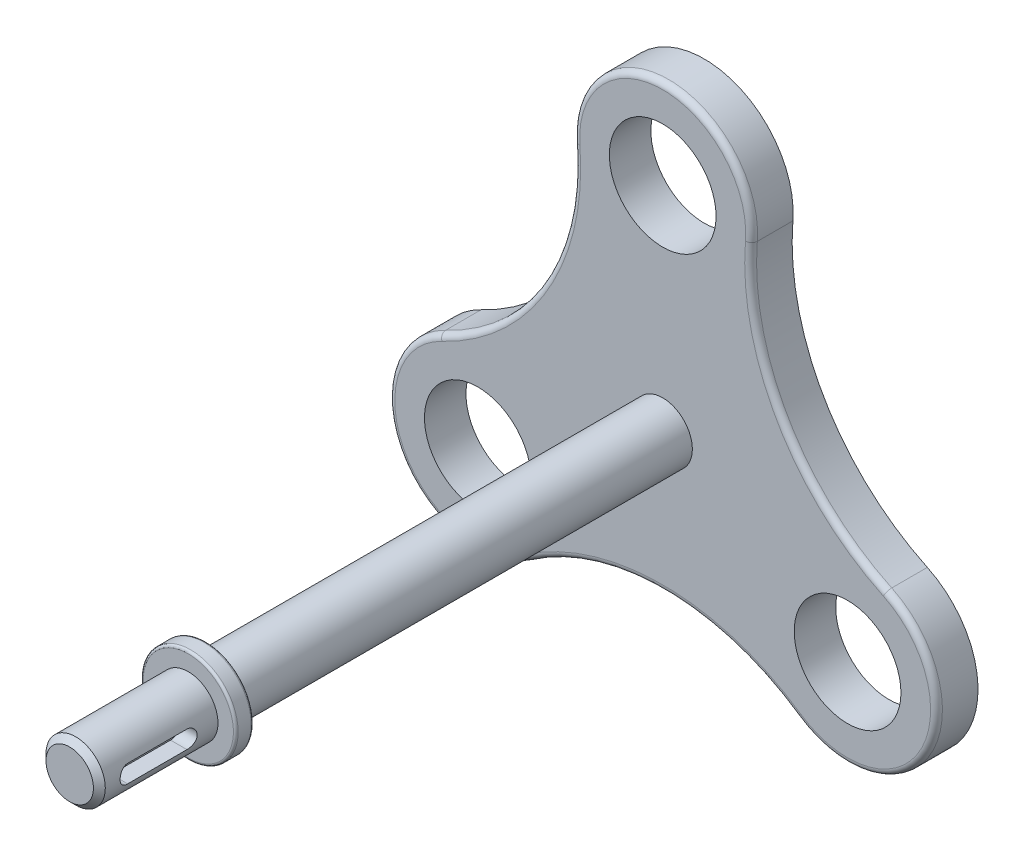
ISO-10303-21;
HEADER;
FILE_DESCRIPTION(('STEP AP214'),'2;1');
FILE_NAME('part.step','',(''),(''),'','','');
FILE_SCHEMA(('AUTOMOTIVE_DESIGN { 1 0 10303 214 1 1 1 1 }'));
ENDSEC;
DATA;
#1=APPLICATION_CONTEXT('core data for automotive mechanical design processes');
#2=APPLICATION_PROTOCOL_DEFINITION('international standard','automotive_design',2000,#1);
#3=PRODUCT_CONTEXT('',#1,'mechanical');
#4=PRODUCT('Part','Part','',(#3));
#5=PRODUCT_RELATED_PRODUCT_CATEGORY('part','',(#4));
#6=PRODUCT_DEFINITION_FORMATION('','',#4);
#7=PRODUCT_DEFINITION_CONTEXT('part definition',#1,'design');
#8=PRODUCT_DEFINITION('design','',#6,#7);
#9=PRODUCT_DEFINITION_SHAPE('','',#8);
#10=(LENGTH_UNIT() NAMED_UNIT(*) SI_UNIT(.MILLI.,.METRE.));
#11=(NAMED_UNIT(*) PLANE_ANGLE_UNIT() SI_UNIT($,.RADIAN.));
#12=(NAMED_UNIT(*) SI_UNIT($,.STERADIAN.) SOLID_ANGLE_UNIT());
#13=UNCERTAINTY_MEASURE_WITH_UNIT(LENGTH_MEASURE(1.E-05),#10,'distance_accuracy_value','');
#14=(GEOMETRIC_REPRESENTATION_CONTEXT(3) GLOBAL_UNCERTAINTY_ASSIGNED_CONTEXT((#13)) GLOBAL_UNIT_ASSIGNED_CONTEXT((#10,
#11,#12)) REPRESENTATION_CONTEXT('',''));
#15=CARTESIAN_POINT('',(0.,0.,0.));
#16=DIRECTION('',(0.,0.,1.));
#17=DIRECTION('',(1.,0.,0.));
#18=AXIS2_PLACEMENT_3D('',#15,#16,#17);
#19=CARTESIAN_POINT('',(13.7070263961467,16.9137553796046,3.5));
#20=DIRECTION('',(0.,0.,-1.));
#21=DIRECTION('',(-1.,0.,0.));
#22=AXIS2_PLACEMENT_3D('',#19,#20,#21);
#23=PLANE('',#22);
#24=CARTESIAN_POINT('',(0.,-31.6550215184183,3.5));
#25=DIRECTION('',(0.,0.,-1.));
#26=DIRECTION('',(-1.,0.,0.));
#27=AXIS2_PLACEMENT_3D('',#24,#25,#26);
#28=CIRCLE('',#27,20.5);
#29=CARTESIAN_POINT('',(-11.6204863271439,-14.7667327501428,3.5));
#30=VERTEX_POINT('',#29);
#31=CARTESIAN_POINT('',(11.6204863271439,-14.7667327501428,3.5));
#32=VERTEX_POINT('',#31);
#33=EDGE_CURVE('E490',#30,#32,#28,.T.);
#34=ORIENTED_EDGE('',*,*,#33,.T.);
#35=CARTESIAN_POINT('',(15.5884572681198,-8.99999999999993,3.5));
#36=DIRECTION('',(0.,0.,-1.));
#37=DIRECTION('',(-1.,0.,0.));
#38=AXIS2_PLACEMENT_3D('',#35,#36,#37);
#39=CIRCLE('',#38,7.00000000000002);
#40=CARTESIAN_POINT('',(18.5986088560913,-2.68026998856484,3.5));
#41=VERTEX_POINT('',#40);
#42=EDGE_CURVE('E497',#32,#41,#39,.F.);
#43=ORIENTED_EDGE('',*,*,#42,.T.);
#44=CARTESIAN_POINT('',(27.4140527922934,15.8275107592093,3.5));
#45=DIRECTION('',(0.,0.,-1.));
#46=DIRECTION('',(-1.,0.,0.));
#47=AXIS2_PLACEMENT_3D('',#44,#45,#46);
#48=CIRCLE('',#47,20.5);
#49=CARTESIAN_POINT('',(6.97812252894742,17.4470027387078,3.5));
#50=VERTEX_POINT('',#49);
#51=EDGE_CURVE('E507',#41,#50,#48,.T.);
#52=ORIENTED_EDGE('',*,*,#51,.T.);
#53=CARTESIAN_POINT('',(0.,18.,3.5));
#54=DIRECTION('',(0.,0.,-1.));
#55=DIRECTION('',(-1.,0.,0.));
#56=AXIS2_PLACEMENT_3D('',#53,#54,#55);
#57=CIRCLE('',#56,7.00000000000002);
#58=CARTESIAN_POINT('',(-6.97812252894742,17.4470027387078,3.5));
#59=VERTEX_POINT('',#58);
#60=EDGE_CURVE('E508',#50,#59,#57,.F.);
#61=ORIENTED_EDGE('',*,*,#60,.T.);
#62=CARTESIAN_POINT('',(-27.4140527922934,15.8275107592093,3.5));
#63=DIRECTION('',(0.,0.,-1.));
#64=DIRECTION('',(-1.,0.,0.));
#65=AXIS2_PLACEMENT_3D('',#62,#63,#64);
#66=CIRCLE('',#65,20.5);
#67=CARTESIAN_POINT('',(-18.5986088560913,-2.68026998856484,3.5));
#68=VERTEX_POINT('',#67);
#69=EDGE_CURVE('E460',#59,#68,#66,.T.);
#70=ORIENTED_EDGE('',*,*,#69,.T.);
#71=CARTESIAN_POINT('',(-15.5884572681199,-8.99999999999992,3.5));
#72=DIRECTION('',(0.,0.,-1.));
#73=DIRECTION('',(-1.,0.,0.));
#74=AXIS2_PLACEMENT_3D('',#71,#72,#73);
#75=CIRCLE('',#74,7.00000000000001);
#76=EDGE_CURVE('E487',#68,#30,#75,.F.);
#77=ORIENTED_EDGE('',*,*,#76,.T.);
#78=EDGE_LOOP('',(#34,#43,#52,#61,#70,#77));
#79=FACE_BOUND('',#78,.T.);
#80=CARTESIAN_POINT('',(0.,0.,3.5));
#81=DIRECTION('',(0.,0.,-1.));
#82=DIRECTION('',(-1.,0.,0.));
#83=AXIS2_PLACEMENT_3D('',#80,#81,#82);
#84=CIRCLE('',#83,2.5);
#85=CARTESIAN_POINT('',(-2.5,0.,3.5));
#86=VERTEX_POINT('',#85);
#87=EDGE_CURVE('E270',#86,#86,#84,.F.);
#88=ORIENTED_EDGE('',*,*,#87,.F.);
#89=EDGE_LOOP('',(#88));
#90=FACE_BOUND('',#89,.T.);
#91=CARTESIAN_POINT('',(0.,18.,3.5));
#92=DIRECTION('',(0.,0.,1.));
#93=DIRECTION('',(1.,0.,0.));
#94=AXIS2_PLACEMENT_3D('',#91,#92,#93);
#95=CIRCLE('',#94,4.5);
#96=CARTESIAN_POINT('',(4.5,18.,3.5));
#97=VERTEX_POINT('',#96);
#98=EDGE_CURVE('E217',#97,#97,#95,.T.);
#99=ORIENTED_EDGE('',*,*,#98,.F.);
#100=EDGE_LOOP('',(#99));
#101=FACE_BOUND('',#100,.T.);
#102=CARTESIAN_POINT('',(15.5884572681198,-8.99999999999993,3.5));
#103=DIRECTION('',(0.,0.,1.));
#104=DIRECTION('',(1.,0.,0.));
#105=AXIS2_PLACEMENT_3D('',#102,#103,#104);
#106=CIRCLE('',#105,4.5);
#107=CARTESIAN_POINT('',(20.0884572681198,-8.99999999999993,3.5));
#108=VERTEX_POINT('',#107);
#109=EDGE_CURVE('E209',#108,#108,#106,.T.);
#110=ORIENTED_EDGE('',*,*,#109,.F.);
#111=EDGE_LOOP('',(#110));
#112=FACE_BOUND('',#111,.T.);
#113=CARTESIAN_POINT('',(-15.5884572681199,-8.99999999999992,3.5));
#114=DIRECTION('',(0.,0.,1.));
#115=DIRECTION('',(1.,0.,0.));
#116=AXIS2_PLACEMENT_3D('',#113,#114,#115);
#117=CIRCLE('',#116,4.5);
#118=CARTESIAN_POINT('',(-11.0884572681199,-8.99999999999992,3.5));
#119=VERTEX_POINT('',#118);
#120=EDGE_CURVE('E205',#119,#119,#117,.T.);
#121=ORIENTED_EDGE('',*,*,#120,.F.);
#122=EDGE_LOOP('',(#121));
#123=FACE_BOUND('',#122,.T.);
#124=ADVANCED_FACE('F50',(#79,#90,#101,#112,#123),#23,.F.);
#125=CARTESIAN_POINT('',(13.7070263961467,16.9137553796046,0.));
#126=DIRECTION('',(0.,0.,-1.));
#127=DIRECTION('',(-1.,0.,0.));
#128=AXIS2_PLACEMENT_3D('',#125,#126,#127);
#129=PLANE('',#128);
#130=CARTESIAN_POINT('',(15.5884572681198,-8.99999999999993,0.));
#131=DIRECTION('',(0.,0.,1.));
#132=DIRECTION('',(1.,0.,0.));
#133=AXIS2_PLACEMENT_3D('',#130,#131,#132);
#134=CIRCLE('',#133,4.5);
#135=CARTESIAN_POINT('',(20.0884572681198,-8.99999999999993,0.));
#136=VERTEX_POINT('',#135);
#137=EDGE_CURVE('E206',#136,#136,#134,.T.);
#138=ORIENTED_EDGE('',*,*,#137,.T.);
#139=EDGE_LOOP('',(#138));
#140=FACE_BOUND('',#139,.T.);
#141=CARTESIAN_POINT('',(27.4140527922934,15.8275107592093,0.));
#142=DIRECTION('',(0.,0.,-1.));
#143=DIRECTION('',(-1.,0.,0.));
#144=AXIS2_PLACEMENT_3D('',#141,#142,#143);
#145=CIRCLE('',#144,20.);
#146=CARTESIAN_POINT('',(18.8136196838035,-2.22886070203378,0.));
#147=VERTEX_POINT('',#146);
#148=CARTESIAN_POINT('',(7.47655985244366,17.4075029343298,0.));
#149=VERTEX_POINT('',#148);
#150=EDGE_CURVE('E225',#147,#149,#145,.T.);
#151=ORIENTED_EDGE('',*,*,#150,.F.);
#152=CARTESIAN_POINT('',(15.5884572681198,-8.99999999999993,0.));
#153=DIRECTION('',(0.,0.,1.));
#154=DIRECTION('',(1.,0.,0.));
#155=AXIS2_PLACEMENT_3D('',#152,#153,#154);
#156=CIRCLE('',#155,7.50000000000002);
#157=CARTESIAN_POINT('',(11.3370598313599,-15.1786422322959,0.));
#158=VERTEX_POINT('',#157);
#159=EDGE_CURVE('E242',#158,#147,#156,.T.);
#160=ORIENTED_EDGE('',*,*,#159,.F.);
#161=CARTESIAN_POINT('',(0.,-31.6550215184183,0.));
#162=DIRECTION('',(0.,0.,-1.));
#163=DIRECTION('',(-1.,0.,0.));
#164=AXIS2_PLACEMENT_3D('',#161,#162,#163);
#165=CIRCLE('',#164,20.);
#166=CARTESIAN_POINT('',(-11.3370598313599,-15.1786422322959,0.));
#167=VERTEX_POINT('',#166);
#168=EDGE_CURVE('E244',#167,#158,#165,.T.);
#169=ORIENTED_EDGE('',*,*,#168,.F.);
#170=CARTESIAN_POINT('',(-15.5884572681199,-8.99999999999992,0.));
#171=DIRECTION('',(0.,0.,1.));
#172=DIRECTION('',(1.,0.,0.));
#173=AXIS2_PLACEMENT_3D('',#170,#171,#172);
#174=CIRCLE('',#173,7.50000000000001);
#175=CARTESIAN_POINT('',(-18.8136196838035,-2.22886070203376,0.));
#176=VERTEX_POINT('',#175);
#177=EDGE_CURVE('E240',#176,#167,#174,.T.);
#178=ORIENTED_EDGE('',*,*,#177,.F.);
#179=CARTESIAN_POINT('',(-27.4140527922934,15.8275107592093,0.));
#180=DIRECTION('',(0.,0.,-1.));
#181=DIRECTION('',(1.,0.,0.));
#182=AXIS2_PLACEMENT_3D('',#179,#180,#181);
#183=CIRCLE('',#182,20.);
#184=CARTESIAN_POINT('',(-7.47655985244366,17.4075029343298,0.));
#185=VERTEX_POINT('',#184);
#186=EDGE_CURVE('E231',#185,#176,#183,.T.);
#187=ORIENTED_EDGE('',*,*,#186,.F.);
#188=CARTESIAN_POINT('',(0.,18.,0.));
#189=DIRECTION('',(0.,0.,1.));
#190=DIRECTION('',(1.,0.,0.));
#191=AXIS2_PLACEMENT_3D('',#188,#189,#190);
#192=CIRCLE('',#191,7.50000000000002);
#193=EDGE_CURVE('E228',#149,#185,#192,.T.);
#194=ORIENTED_EDGE('',*,*,#193,.F.);
#195=EDGE_LOOP('',(#151,#160,#169,#178,#187,#194));
#196=FACE_BOUND('',#195,.T.);
#197=CARTESIAN_POINT('',(0.,18.,0.));
#198=DIRECTION('',(0.,0.,1.));
#199=DIRECTION('',(1.,0.,0.));
#200=AXIS2_PLACEMENT_3D('',#197,#198,#199);
#201=CIRCLE('',#200,4.5);
#202=CARTESIAN_POINT('',(4.5,18.,0.));
#203=VERTEX_POINT('',#202);
#204=EDGE_CURVE('E212',#203,#203,#201,.T.);
#205=ORIENTED_EDGE('',*,*,#204,.T.);
#206=EDGE_LOOP('',(#205));
#207=FACE_BOUND('',#206,.T.);
#208=CARTESIAN_POINT('',(-15.5884572681199,-8.99999999999992,0.));
#209=DIRECTION('',(0.,0.,1.));
#210=DIRECTION('',(1.,0.,0.));
#211=AXIS2_PLACEMENT_3D('',#208,#209,#210);
#212=CIRCLE('',#211,4.5);
#213=CARTESIAN_POINT('',(-11.0884572681199,-8.99999999999992,0.));
#214=VERTEX_POINT('',#213);
#215=EDGE_CURVE('E203',#214,#214,#212,.T.);
#216=ORIENTED_EDGE('',*,*,#215,.T.);
#217=EDGE_LOOP('',(#216));
#218=FACE_BOUND('',#217,.T.);
#219=ADVANCED_FACE('F309',(#140,#196,#207,#218),#129,.T.);
#220=CARTESIAN_POINT('',(27.4140527922934,15.8275107592093,3.5));
#221=DIRECTION('',(0.,0.,-1.));
#222=DIRECTION('',(-1.,0.,0.));
#223=AXIS2_PLACEMENT_3D('',#220,#221,#222);
#224=CYLINDRICAL_SURFACE('',#223,20.);
#225=DIRECTION('',(0.,0.,-1.));
#226=VECTOR('',#225,1.);
#227=CARTESIAN_POINT('',(7.47655985244366,17.4075029343298,3.5));
#228=LINE('',#227,#226);
#229=CARTESIAN_POINT('',(7.47655985244366,17.4075029343298,3.));
#230=VERTEX_POINT('',#229);
#231=EDGE_CURVE('E262',#230,#149,#228,.T.);
#232=ORIENTED_EDGE('',*,*,#231,.F.);
#233=CARTESIAN_POINT('',(27.4140527922934,15.8275107592093,3.));
#234=DIRECTION('',(0.,0.,-1.));
#235=DIRECTION('',(-1.,0.,0.));
#236=AXIS2_PLACEMENT_3D('',#233,#234,#235);
#237=CIRCLE('',#236,20.);
#238=CARTESIAN_POINT('',(18.8136196838035,-2.22886070203378,3.));
#239=VERTEX_POINT('',#238);
#240=EDGE_CURVE('E396',#230,#239,#237,.F.);
#241=ORIENTED_EDGE('',*,*,#240,.T.);
#242=DIRECTION('',(0.,0.,-1.));
#243=VECTOR('',#242,1.);
#244=CARTESIAN_POINT('',(18.8136196838035,-2.22886070203378,3.5));
#245=LINE('',#244,#243);
#246=EDGE_CURVE('E247',#239,#147,#245,.T.);
#247=ORIENTED_EDGE('',*,*,#246,.T.);
#248=ORIENTED_EDGE('',*,*,#150,.T.);
#249=EDGE_LOOP('',(#232,#241,#247,#248));
#250=FACE_BOUND('',#249,.T.);
#251=ADVANCED_FACE('F318',(#250),#224,.F.);
#252=CARTESIAN_POINT('',(0.,18.,3.5));
#253=DIRECTION('',(0.,0.,-1.));
#254=DIRECTION('',(-1.,0.,0.));
#255=AXIS2_PLACEMENT_3D('',#252,#253,#254);
#256=CYLINDRICAL_SURFACE('',#255,7.50000000000002);
#257=DIRECTION('',(0.,0.,-1.));
#258=VECTOR('',#257,1.);
#259=CARTESIAN_POINT('',(-7.47655985244366,17.4075029343298,3.5));
#260=LINE('',#259,#258);
#261=CARTESIAN_POINT('',(-7.47655985244366,17.4075029343298,3.));
#262=VERTEX_POINT('',#261);
#263=EDGE_CURVE('E261',#262,#185,#260,.T.);
#264=ORIENTED_EDGE('',*,*,#263,.F.);
#265=CARTESIAN_POINT('',(0.,18.,3.));
#266=DIRECTION('',(0.,0.,-1.));
#267=DIRECTION('',(-1.,0.,0.));
#268=AXIS2_PLACEMENT_3D('',#265,#266,#267);
#269=CIRCLE('',#268,7.50000000000002);
#270=EDGE_CURVE('E63',#262,#230,#269,.T.);
#271=ORIENTED_EDGE('',*,*,#270,.T.);
#272=ORIENTED_EDGE('',*,*,#231,.T.);
#273=ORIENTED_EDGE('',*,*,#193,.T.);
#274=EDGE_LOOP('',(#264,#271,#272,#273));
#275=FACE_BOUND('',#274,.T.);
#276=ADVANCED_FACE('F343',(#275),#256,.T.);
#277=CARTESIAN_POINT('',(-27.4140527922934,15.8275107592093,3.5));
#278=DIRECTION('',(0.,0.,-1.));
#279=DIRECTION('',(-1.,0.,0.));
#280=AXIS2_PLACEMENT_3D('',#277,#278,#279);
#281=CYLINDRICAL_SURFACE('',#280,20.);
#282=DIRECTION('',(0.,0.,-1.));
#283=VECTOR('',#282,1.);
#284=CARTESIAN_POINT('',(-18.8136196838035,-2.22886070203376,3.5));
#285=LINE('',#284,#283);
#286=CARTESIAN_POINT('',(-18.8136196838035,-2.22886070203376,3.));
#287=VERTEX_POINT('',#286);
#288=EDGE_CURVE('E256',#287,#176,#285,.T.);
#289=ORIENTED_EDGE('',*,*,#288,.F.);
#290=CARTESIAN_POINT('',(-27.4140527922934,15.8275107592093,3.));
#291=DIRECTION('',(0.,0.,-1.));
#292=DIRECTION('',(-1.,0.,0.));
#293=AXIS2_PLACEMENT_3D('',#290,#291,#292);
#294=CIRCLE('',#293,20.);
#295=EDGE_CURVE('E75',#287,#262,#294,.F.);
#296=ORIENTED_EDGE('',*,*,#295,.T.);
#297=ORIENTED_EDGE('',*,*,#263,.T.);
#298=ORIENTED_EDGE('',*,*,#186,.T.);
#299=EDGE_LOOP('',(#289,#296,#297,#298));
#300=FACE_BOUND('',#299,.T.);
#301=ADVANCED_FACE('F336',(#300),#281,.F.);
#302=CARTESIAN_POINT('',(-15.5884572681199,-8.99999999999992,3.5));
#303=DIRECTION('',(0.,0.,-1.));
#304=DIRECTION('',(-1.,0.,0.));
#305=AXIS2_PLACEMENT_3D('',#302,#303,#304);
#306=CYLINDRICAL_SURFACE('',#305,7.50000000000001);
#307=DIRECTION('',(0.,0.,-1.));
#308=VECTOR('',#307,1.);
#309=CARTESIAN_POINT('',(-11.3370598313599,-15.1786422322959,3.5));
#310=LINE('',#309,#308);
#311=CARTESIAN_POINT('',(-11.3370598313599,-15.1786422322959,3.));
#312=VERTEX_POINT('',#311);
#313=EDGE_CURVE('E254',#312,#167,#310,.T.);
#314=ORIENTED_EDGE('',*,*,#313,.F.);
#315=CARTESIAN_POINT('',(-15.5884572681199,-8.99999999999992,3.));
#316=DIRECTION('',(0.,0.,-1.));
#317=DIRECTION('',(-1.,0.,0.));
#318=AXIS2_PLACEMENT_3D('',#315,#316,#317);
#319=CIRCLE('',#318,7.50000000000001);
#320=EDGE_CURVE('E455',#312,#287,#319,.T.);
#321=ORIENTED_EDGE('',*,*,#320,.T.);
#322=ORIENTED_EDGE('',*,*,#288,.T.);
#323=ORIENTED_EDGE('',*,*,#177,.T.);
#324=EDGE_LOOP('',(#314,#321,#322,#323));
#325=FACE_BOUND('',#324,.T.);
#326=ADVANCED_FACE('F334',(#325),#306,.T.);
#327=CARTESIAN_POINT('',(0.,-31.6550215184183,3.5));
#328=DIRECTION('',(0.,0.,-1.));
#329=DIRECTION('',(-1.,0.,0.));
#330=AXIS2_PLACEMENT_3D('',#327,#328,#329);
#331=CYLINDRICAL_SURFACE('',#330,20.);
#332=DIRECTION('',(0.,0.,-1.));
#333=VECTOR('',#332,1.);
#334=CARTESIAN_POINT('',(11.3370598313599,-15.1786422322959,3.5));
#335=LINE('',#334,#333);
#336=CARTESIAN_POINT('',(11.3370598313599,-15.1786422322959,3.));
#337=VERTEX_POINT('',#336);
#338=EDGE_CURVE('E252',#337,#158,#335,.T.);
#339=ORIENTED_EDGE('',*,*,#338,.F.);
#340=CARTESIAN_POINT('',(0.,-31.6550215184183,3.));
#341=DIRECTION('',(0.,0.,-1.));
#342=DIRECTION('',(-1.,0.,0.));
#343=AXIS2_PLACEMENT_3D('',#340,#341,#342);
#344=CIRCLE('',#343,20.);
#345=EDGE_CURVE('E486',#337,#312,#344,.F.);
#346=ORIENTED_EDGE('',*,*,#345,.T.);
#347=ORIENTED_EDGE('',*,*,#313,.T.);
#348=ORIENTED_EDGE('',*,*,#168,.T.);
#349=EDGE_LOOP('',(#339,#346,#347,#348));
#350=FACE_BOUND('',#349,.T.);
#351=ADVANCED_FACE('F328',(#350),#331,.F.);
#352=CARTESIAN_POINT('',(15.5884572681198,-8.99999999999993,3.5));
#353=DIRECTION('',(0.,0.,-1.));
#354=DIRECTION('',(-1.,0.,0.));
#355=AXIS2_PLACEMENT_3D('',#352,#353,#354);
#356=CYLINDRICAL_SURFACE('',#355,7.50000000000002);
#357=ORIENTED_EDGE('',*,*,#246,.F.);
#358=CARTESIAN_POINT('',(15.5884572681198,-8.99999999999993,3.));
#359=DIRECTION('',(0.,0.,-1.));
#360=DIRECTION('',(-1.,0.,0.));
#361=AXIS2_PLACEMENT_3D('',#358,#359,#360);
#362=CIRCLE('',#361,7.50000000000002);
#363=EDGE_CURVE('E450',#239,#337,#362,.T.);
#364=ORIENTED_EDGE('',*,*,#363,.T.);
#365=ORIENTED_EDGE('',*,*,#338,.T.);
#366=ORIENTED_EDGE('',*,*,#159,.T.);
#367=EDGE_LOOP('',(#357,#364,#365,#366));
#368=FACE_BOUND('',#367,.T.);
#369=ADVANCED_FACE('F326',(#368),#356,.T.);
#370=CARTESIAN_POINT('',(0.,18.,3.5));
#371=DIRECTION('',(0.,0.,-1.));
#372=DIRECTION('',(-1.,0.,0.));
#373=AXIS2_PLACEMENT_3D('',#370,#371,#372);
#374=CYLINDRICAL_SURFACE('',#373,4.5);
#375=ORIENTED_EDGE('',*,*,#98,.T.);
#376=EDGE_LOOP('',(#375));
#377=FACE_BOUND('',#376,.T.);
#378=ORIENTED_EDGE('',*,*,#204,.F.);
#379=EDGE_LOOP('',(#378));
#380=FACE_BOUND('',#379,.T.);
#381=ADVANCED_FACE('F323',(#377,#380),#374,.F.);
#382=CARTESIAN_POINT('',(15.5884572681198,-8.99999999999993,3.5));
#383=DIRECTION('',(0.,0.,-1.));
#384=DIRECTION('',(-1.,0.,0.));
#385=AXIS2_PLACEMENT_3D('',#382,#383,#384);
#386=CYLINDRICAL_SURFACE('',#385,4.5);
#387=ORIENTED_EDGE('',*,*,#109,.T.);
#388=EDGE_LOOP('',(#387));
#389=FACE_BOUND('',#388,.T.);
#390=ORIENTED_EDGE('',*,*,#137,.F.);
#391=EDGE_LOOP('',(#390));
#392=FACE_BOUND('',#391,.T.);
#393=ADVANCED_FACE('F417',(#389,#392),#386,.F.);
#394=CARTESIAN_POINT('',(-15.5884572681199,-8.99999999999992,3.5));
#395=DIRECTION('',(0.,0.,-1.));
#396=DIRECTION('',(-1.,0.,0.));
#397=AXIS2_PLACEMENT_3D('',#394,#395,#396);
#398=CYLINDRICAL_SURFACE('',#397,4.5);
#399=ORIENTED_EDGE('',*,*,#120,.T.);
#400=EDGE_LOOP('',(#399));
#401=FACE_BOUND('',#400,.T.);
#402=ORIENTED_EDGE('',*,*,#215,.F.);
#403=EDGE_LOOP('',(#402));
#404=FACE_BOUND('',#403,.T.);
#405=ADVANCED_FACE('F408',(#401,#404),#398,.F.);
#406=CARTESIAN_POINT('',(0.,2.5,53.5));
#407=DIRECTION('',(0.,0.,-1.));
#408=DIRECTION('',(-1.,0.,0.));
#409=AXIS2_PLACEMENT_3D('',#406,#407,#408);
#410=PLANE('',#409);
#411=CARTESIAN_POINT('',(0.,0.,53.5));
#412=DIRECTION('',(0.,0.,-1.));
#413=DIRECTION('',(-1.,0.,0.));
#414=AXIS2_PLACEMENT_3D('',#411,#412,#413);
#415=CIRCLE('',#414,2.);
#416=CARTESIAN_POINT('',(-2.,0.,53.5));
#417=VERTEX_POINT('',#416);
#418=EDGE_CURVE('E60',#417,#417,#415,.F.);
#419=ORIENTED_EDGE('',*,*,#418,.T.);
#420=EDGE_LOOP('',(#419));
#421=FACE_BOUND('',#420,.T.);
#422=ADVANCED_FACE('F409',(#421),#410,.F.);
#423=CARTESIAN_POINT('',(0.,0.,49.5968890256143));
#424=DIRECTION('',(0.,0.,1.));
#425=DIRECTION('',(1.,0.,0.));
#426=AXIS2_PLACEMENT_3D('',#423,#424,#425);
#427=CYLINDRICAL_SURFACE('',#426,2.5);
#428=CARTESIAN_POINT('',(0.,0.,42.));
#429=DIRECTION('',(0.,0.,1.));
#430=DIRECTION('',(1.,0.,0.));
#431=AXIS2_PLACEMENT_3D('',#428,#429,#430);
#432=CIRCLE('',#431,2.5);
#433=CARTESIAN_POINT('',(2.5,0.,42.));
#434=VERTEX_POINT('',#433);
#435=EDGE_CURVE('E197',#434,#434,#432,.T.);
#436=ORIENTED_EDGE('',*,*,#435,.F.);
#437=EDGE_LOOP('',(#436));
#438=FACE_BOUND('',#437,.T.);
#439=ORIENTED_EDGE('',*,*,#87,.T.);
#440=EDGE_LOOP('',(#439));
#441=FACE_BOUND('',#440,.T.);
#442=ADVANCED_FACE('F410',(#438,#441),#427,.T.);
#443=CARTESIAN_POINT('',(0.,4.,42.));
#444=DIRECTION('',(0.,0.,1.));
#445=DIRECTION('',(1.,0.,0.));
#446=AXIS2_PLACEMENT_3D('',#443,#444,#445);
#447=PLANE('',#446);
#448=CARTESIAN_POINT('',(0.,0.,42.));
#449=DIRECTION('',(0.,0.,1.));
#450=DIRECTION('',(1.,0.,0.));
#451=AXIS2_PLACEMENT_3D('',#448,#449,#450);
#452=CIRCLE('',#451,3.8);
#453=CARTESIAN_POINT('',(3.8,0.,42.));
#454=VERTEX_POINT('',#453);
#455=EDGE_CURVE('E383',#454,#454,#452,.F.);
#456=ORIENTED_EDGE('',*,*,#455,.T.);
#457=EDGE_LOOP('',(#456));
#458=FACE_BOUND('',#457,.T.);
#459=ORIENTED_EDGE('',*,*,#435,.T.);
#460=EDGE_LOOP('',(#459));
#461=FACE_BOUND('',#460,.T.);
#462=ADVANCED_FACE('F411',(#458,#461),#447,.F.);
#463=CARTESIAN_POINT('',(0.,0.,49.5968890256143));
#464=DIRECTION('',(0.,0.,1.));
#465=DIRECTION('',(1.,0.,0.));
#466=AXIS2_PLACEMENT_3D('',#463,#464,#465);
#467=CYLINDRICAL_SURFACE('',#466,4.);
#468=CARTESIAN_POINT('',(0.,0.,43.3));
#469=DIRECTION('',(0.,0.,-1.));
#470=DIRECTION('',(-1.,0.,0.));
#471=AXIS2_PLACEMENT_3D('',#468,#469,#470);
#472=CIRCLE('',#471,4.);
#473=CARTESIAN_POINT('',(-4.,0.,43.3));
#474=VERTEX_POINT('',#473);
#475=EDGE_CURVE('E388',#474,#474,#472,.T.);
#476=ORIENTED_EDGE('',*,*,#475,.T.);
#477=EDGE_LOOP('',(#476));
#478=FACE_BOUND('',#477,.T.);
#479=CARTESIAN_POINT('',(0.,0.,42.2));
#480=DIRECTION('',(0.,0.,1.));
#481=DIRECTION('',(1.,0.,0.));
#482=AXIS2_PLACEMENT_3D('',#479,#480,#481);
#483=CIRCLE('',#482,4.);
#484=CARTESIAN_POINT('',(4.,0.,42.2));
#485=VERTEX_POINT('',#484);
#486=EDGE_CURVE('E390',#485,#485,#483,.T.);
#487=ORIENTED_EDGE('',*,*,#486,.T.);
#488=EDGE_LOOP('',(#487));
#489=FACE_BOUND('',#488,.T.);
#490=ADVANCED_FACE('F521',(#478,#489),#467,.T.);
#491=CARTESIAN_POINT('',(0.,2.5,43.5));
#492=DIRECTION('',(0.,0.,-1.));
#493=DIRECTION('',(-1.,0.,0.));
#494=AXIS2_PLACEMENT_3D('',#491,#492,#493);
#495=PLANE('',#494);
#496=CARTESIAN_POINT('',(0.,0.,43.5));
#497=DIRECTION('',(0.,0.,-1.));
#498=DIRECTION('',(-1.,0.,0.));
#499=AXIS2_PLACEMENT_3D('',#496,#497,#498);
#500=CIRCLE('',#499,3.8);
#501=CARTESIAN_POINT('',(-3.8,0.,43.5));
#502=VERTEX_POINT('',#501);
#503=EDGE_CURVE('E394',#502,#502,#500,.F.);
#504=ORIENTED_EDGE('',*,*,#503,.T.);
#505=EDGE_LOOP('',(#504));
#506=FACE_BOUND('',#505,.T.);
#507=CARTESIAN_POINT('',(0.,0.,43.5));
#508=DIRECTION('',(0.,0.,1.));
#509=DIRECTION('',(1.,0.,0.));
#510=AXIS2_PLACEMENT_3D('',#507,#508,#509);
#511=CIRCLE('',#510,2.5);
#512=CARTESIAN_POINT('',(2.5,0.,43.5));
#513=VERTEX_POINT('',#512);
#514=EDGE_CURVE('E186',#513,#513,#511,.T.);
#515=ORIENTED_EDGE('',*,*,#514,.F.);
#516=EDGE_LOOP('',(#515));
#517=FACE_BOUND('',#516,.T.);
#518=ADVANCED_FACE('F307',(#506,#517),#495,.F.);
#519=CARTESIAN_POINT('',(0.,0.,49.5968890256143));
#520=DIRECTION('',(0.,0.,1.));
#521=DIRECTION('',(1.,0.,0.));
#522=AXIS2_PLACEMENT_3D('',#519,#520,#521);
#523=CYLINDRICAL_SURFACE('',#522,2.5);
#524=CARTESIAN_POINT('',(0.,0.,53.));
#525=DIRECTION('',(0.,0.,-1.));
#526=DIRECTION('',(-1.,0.,0.));
#527=AXIS2_PLACEMENT_3D('',#524,#525,#526);
#528=CIRCLE('',#527,2.5);
#529=CARTESIAN_POINT('',(-2.5,0.,53.));
#530=VERTEX_POINT('',#529);
#531=EDGE_CURVE('E11',#530,#530,#528,.T.);
#532=ORIENTED_EDGE('',*,*,#531,.T.);
#533=EDGE_LOOP('',(#532));
#534=FACE_BOUND('',#533,.T.);
#535=DIRECTION('',(0.,0.,1.));
#536=VECTOR('',#535,1.);
#537=CARTESIAN_POINT('',(2.38484800354236,0.75,49.5968890256143));
#538=LINE('',#537,#536);
#539=CARTESIAN_POINT('',(2.38484800354236,0.75,51.));
#540=VERTEX_POINT('',#539);
#541=CARTESIAN_POINT('',(2.38484800354236,0.750000000000001,46.));
#542=VERTEX_POINT('',#541);
#543=EDGE_CURVE('E515',#540,#542,#538,.F.);
#544=ORIENTED_EDGE('',*,*,#543,.T.);
#545=CARTESIAN_POINT('',(2.38484800354236,0.750000000000001,46.));
#546=CARTESIAN_POINT('',(2.38480499347122,0.750040111457239,45.9588202046912));
#547=CARTESIAN_POINT('',(2.38591354986241,0.74661134535269,45.9176734161859));
#548=CARTESIAN_POINT('',(2.39010352878136,0.733138859179256,45.8366857278894));
#549=CARTESIAN_POINT('',(2.39317981940718,0.723112344261092,45.7968417137237));
#550=CARTESIAN_POINT('',(2.40097679411834,0.696768768245689,45.7194873000942));
#551=CARTESIAN_POINT('',(2.40569690257587,0.680453908971175,45.6819760891477));
#552=CARTESIAN_POINT('',(2.41623365220714,0.642038331551051,45.6102002933183));
#553=CARTESIAN_POINT('',(2.42205080329133,0.619934920995878,45.5759372293624));
#554=CARTESIAN_POINT('',(2.43433395394983,0.569824497311364,45.5105673533381));
#555=CARTESIAN_POINT('',(2.44081371746184,0.541667232760279,45.4795782720843));
#556=CARTESIAN_POINT('',(2.45357411740833,0.480569394491399,45.4226821057768));
#557=CARTESIAN_POINT('',(2.4598547200499,0.447628014257076,45.3967758793365));
#558=CARTESIAN_POINT('',(2.47166618218142,0.377054978724886,45.3502681430748));
#559=CARTESIAN_POINT('',(2.47717885045192,0.339340414503925,45.3297874174081));
#560=CARTESIAN_POINT('',(2.48667235363475,0.260810587918342,45.2955057866358));
#561=CARTESIAN_POINT('',(2.49065358348348,0.219996128228621,45.2817031591059));
#562=CARTESIAN_POINT('',(2.49653819854433,0.137662350178745,45.2615601023888));
#563=CARTESIAN_POINT('',(2.49849774608235,0.096196562979348,45.2550175715343));
#564=CARTESIAN_POINT('',(2.50031601041468,0.0127117856668874,45.2489413287993));
#565=CARTESIAN_POINT('',(2.50017512493719,-0.029307098208843,45.2494062900129));
#566=CARTESIAN_POINT('',(2.49784801275404,-0.111285799888132,45.2571964545121));
#567=CARTESIAN_POINT('',(2.49572707752526,-0.151268572709565,45.2643026725249));
#568=CARTESIAN_POINT('',(2.48975756852057,-0.229445026073761,45.2848158175835));
#569=CARTESIAN_POINT('',(2.48590890423554,-0.267638612772124,45.2982230747184));
#570=CARTESIAN_POINT('',(2.47682607462526,-0.341673907939903,45.3311061108329));
#571=CARTESIAN_POINT('',(2.47157627846182,-0.377483003020406,45.3506508221811));
#572=CARTESIAN_POINT('',(2.46024812325958,-0.445382764788868,45.3951992950215));
#573=CARTESIAN_POINT('',(2.45416957867719,-0.477472595807738,45.4202042797386));
#574=CARTESIAN_POINT('',(2.44155836785937,-0.538327252705909,45.4760959940426));
#575=CARTESIAN_POINT('',(2.4350172272581,-0.566916757390076,45.5071719318809));
#576=CARTESIAN_POINT('',(2.42242107556296,-0.618533847462525,45.5737487117134));
#577=CARTESIAN_POINT('',(2.41636620664882,-0.641559810065288,45.6092508401815));
#578=CARTESIAN_POINT('',(2.40538614401767,-0.681582036204416,45.6841404642259));
#579=CARTESIAN_POINT('',(2.40047298137762,-0.69851503170617,45.7235635898014));
#580=CARTESIAN_POINT('',(2.39247831811836,-0.725429430022996,45.8048622519862));
#581=CARTESIAN_POINT('',(2.38939401682852,-0.735421466088288,45.8467339303398));
#582=CARTESIAN_POINT('',(2.38657016186342,-0.744506017950761,45.9074974445396));
#583=CARTESIAN_POINT('',(2.38592578203151,-0.74656601494661,45.9259453671044));
#584=CARTESIAN_POINT('',(2.38506464401053,-0.749311778076851,45.9629257395722));
#585=CARTESIAN_POINT('',(2.3848472570653,-0.74999956484374,45.9814580248521));
#586=CARTESIAN_POINT('',(2.38484800354236,-0.749999999999999,46.));
#587=B_SPLINE_CURVE_WITH_KNOTS('',3,(#545,#546,#547,#548,#549,#550,#551,#552,#553,#554,#555,
#556,#557,#558,#559,#560,#561,#562,#563,#564,#565,#566,#567,#568,#569,#570,#571,#572,#573,#574,
#575,#576,#577,#578,#579,#580,#581,#582,#583,#584,#585,#586),.UNSPECIFIED.,.F.,.F.,(4,2,2,2,2,2,
2,2,2,2,2,2,2,2,2,2,2,2,2,2,4),(0.,0.123330826138294,0.246341306519376,0.369308754653931,
0.492333500125818,0.618863185705789,0.745414226746454,0.874582412699048,1.00371726562805,
1.12915938831078,1.25457775815912,1.3760012817766,1.49743116705095,1.62027684452542,
1.74315007049679,1.87074847326668,1.99838404939566,2.1273091220694,2.2560362489128,
2.31171105543165,2.36730381796142),.UNSPECIFIED.);
#588=CARTESIAN_POINT('',(2.38484800354236,-0.749999999999999,46.));
#589=VERTEX_POINT('',#588);
#590=EDGE_CURVE('E271',#542,#589,#587,.T.);
#591=ORIENTED_EDGE('',*,*,#590,.T.);
#592=DIRECTION('',(0.,0.,1.));
#593=VECTOR('',#592,1.);
#594=CARTESIAN_POINT('',(2.38484800354236,-0.75,49.5968890256143));
#595=LINE('',#594,#593);
#596=CARTESIAN_POINT('',(2.38484800354236,-0.75,51.));
#597=VERTEX_POINT('',#596);
#598=EDGE_CURVE('E513',#589,#597,#595,.T.);
#599=ORIENTED_EDGE('',*,*,#598,.T.);
#600=CARTESIAN_POINT('',(2.38484800354236,-0.75,51.));
#601=CARTESIAN_POINT('',(2.38480499347122,-0.750040111457238,51.0411797953088));
#602=CARTESIAN_POINT('',(2.38591354986241,-0.74661134535269,51.0823265838141));
#603=CARTESIAN_POINT('',(2.39010352878137,-0.733138859179255,51.1633142721106));
#604=CARTESIAN_POINT('',(2.39317981940718,-0.723112344261091,51.2031582862763));
#605=CARTESIAN_POINT('',(2.40097679411834,-0.696768768245688,51.2805126999058));
#606=CARTESIAN_POINT('',(2.40569690257587,-0.680453908971174,51.3180239108523));
#607=CARTESIAN_POINT('',(2.41623365220714,-0.642038331551051,51.3897997066817));
#608=CARTESIAN_POINT('',(2.42205080329133,-0.619934920995878,51.4240627706376));
#609=CARTESIAN_POINT('',(2.43433395394983,-0.569824497311364,51.4894326466619));
#610=CARTESIAN_POINT('',(2.44081371746184,-0.54166723276028,51.5204217279158));
#611=CARTESIAN_POINT('',(2.45357411740833,-0.4805693944914,51.5773178942232));
#612=CARTESIAN_POINT('',(2.4598547200499,-0.447628014257077,51.6032241206636));
#613=CARTESIAN_POINT('',(2.47166618218142,-0.377054978724885,51.6497318569252));
#614=CARTESIAN_POINT('',(2.47717885045192,-0.339340414503924,51.670212582592));
#615=CARTESIAN_POINT('',(2.48667235363475,-0.260810587918341,51.7044942133642));
#616=CARTESIAN_POINT('',(2.49065358348348,-0.21999612822862,51.7182968408941));
#617=CARTESIAN_POINT('',(2.49653819854433,-0.137662350178744,51.7384398976112));
#618=CARTESIAN_POINT('',(2.49849774608235,-0.0961965629793474,51.7449824284657));
#619=CARTESIAN_POINT('',(2.50031601041468,-0.0127117856668869,51.7510586712007));
#620=CARTESIAN_POINT('',(2.50017512493719,0.0293070982088436,51.7505937099871));
#621=CARTESIAN_POINT('',(2.49784801275404,0.111285799888132,51.7428035454879));
#622=CARTESIAN_POINT('',(2.49572707752526,0.151268572709566,51.7356973274751));
#623=CARTESIAN_POINT('',(2.48975756852057,0.229445026073761,51.7151841824165));
#624=CARTESIAN_POINT('',(2.48590890423554,0.267638612772125,51.7017769252816));
#625=CARTESIAN_POINT('',(2.47682607462526,0.341673907939904,51.6688938891671));
#626=CARTESIAN_POINT('',(2.47157627846182,0.377483003020407,51.6493491778189));
#627=CARTESIAN_POINT('',(2.46024812325958,0.445382764788869,51.6048007049785));
#628=CARTESIAN_POINT('',(2.45416957867719,0.477472595807739,51.5797957202614));
#629=CARTESIAN_POINT('',(2.44155836785937,0.53832725270591,51.5239040059574));
#630=CARTESIAN_POINT('',(2.4350172272581,0.566916757390077,51.4928280681191));
#631=CARTESIAN_POINT('',(2.42242107556296,0.618533847462526,51.4262512882866));
#632=CARTESIAN_POINT('',(2.41636620664882,0.641559810065288,51.3907491598185));
#633=CARTESIAN_POINT('',(2.40538614401767,0.681582036204417,51.3158595357741));
#634=CARTESIAN_POINT('',(2.40047298137762,0.69851503170617,51.2764364101986));
#635=CARTESIAN_POINT('',(2.39247831811836,0.725429430022997,51.1951377480138));
#636=CARTESIAN_POINT('',(2.38939401682852,0.735421466088289,51.1532660696602));
#637=CARTESIAN_POINT('',(2.38657016186342,0.744506017950762,51.0925025554604));
#638=CARTESIAN_POINT('',(2.3859257820315,0.746566014946611,51.0740546328956));
#639=CARTESIAN_POINT('',(2.38506464401053,0.749311778076852,51.0370742604278));
#640=CARTESIAN_POINT('',(2.3848472570653,0.749999564843741,51.0185419751479));
#641=CARTESIAN_POINT('',(2.38484800354236,0.75,51.));
#642=B_SPLINE_CURVE_WITH_KNOTS('',3,(#600,#601,#602,#603,#604,#605,#606,#607,#608,#609,#610,
#611,#612,#613,#614,#615,#616,#617,#618,#619,#620,#621,#622,#623,#624,#625,#626,#627,#628,#629,
#630,#631,#632,#633,#634,#635,#636,#637,#638,#639,#640,#641),.UNSPECIFIED.,.F.,.F.,(4,2,2,2,2,2,
2,2,2,2,2,2,2,2,2,2,2,2,2,2,4),(0.,0.123330826138294,0.246341306519376,0.369308754653931,
0.492333500125818,0.618863185705782,0.745414226746453,0.874582412699048,1.00371726562805,
1.12915938831078,1.25457775815912,1.3760012817766,1.49743116705095,1.62027684452542,
1.74315007049679,1.87074847326668,1.99838404939566,2.1273091220694,2.2560362489128,
2.31171105543165,2.36730381796142),.UNSPECIFIED.);
#643=EDGE_CURVE('E153',#597,#540,#642,.T.);
#644=ORIENTED_EDGE('',*,*,#643,.T.);
#645=EDGE_LOOP('',(#544,#591,#599,#644));
#646=FACE_BOUND('',#645,.T.);
#647=ORIENTED_EDGE('',*,*,#514,.T.);
#648=EDGE_LOOP('',(#647));
#649=FACE_BOUND('',#648,.T.);
#650=ADVANCED_FACE('F290',(#534,#646,#649),#523,.T.);
#651=CARTESIAN_POINT('',(1.,0.,51.));
#652=DIRECTION('',(1.,0.,0.));
#653=DIRECTION('',(0.,0.,-1.));
#654=AXIS2_PLACEMENT_3D('',#651,#652,#653);
#655=CYLINDRICAL_SURFACE('',#654,0.75);
#656=DIRECTION('',(1.,0.,0.));
#657=VECTOR('',#656,1.);
#658=CARTESIAN_POINT('',(1.,-0.75,51.));
#659=LINE('',#658,#657);
#660=CARTESIAN_POINT('',(1.,-0.75,51.));
#661=VERTEX_POINT('',#660);
#662=EDGE_CURVE('E144',#661,#597,#659,.T.);
#663=ORIENTED_EDGE('',*,*,#662,.F.);
#664=CARTESIAN_POINT('',(1.,0.,51.));
#665=DIRECTION('',(1.,0.,0.));
#666=DIRECTION('',(0.,0.,-1.));
#667=AXIS2_PLACEMENT_3D('',#664,#665,#666);
#668=CIRCLE('',#667,0.75);
#669=CARTESIAN_POINT('',(1.,0.75,51.));
#670=VERTEX_POINT('',#669);
#671=EDGE_CURVE('E147',#670,#661,#668,.T.);
#672=ORIENTED_EDGE('',*,*,#671,.F.);
#673=DIRECTION('',(1.,0.,0.));
#674=VECTOR('',#673,1.);
#675=CARTESIAN_POINT('',(1.,0.75,51.));
#676=LINE('',#675,#674);
#677=EDGE_CURVE('E184',#670,#540,#676,.T.);
#678=ORIENTED_EDGE('',*,*,#677,.T.);
#679=ORIENTED_EDGE('',*,*,#643,.F.);
#680=EDGE_LOOP('',(#663,#672,#678,#679));
#681=FACE_BOUND('',#680,.T.);
#682=ADVANCED_FACE('F150',(#681),#655,.F.);
#683=CARTESIAN_POINT('',(1.,0.75,51.));
#684=DIRECTION('',(0.,1.,0.));
#685=DIRECTION('',(0.,0.,1.));
#686=AXIS2_PLACEMENT_3D('',#683,#684,#685);
#687=PLANE('',#686);
#688=ORIENTED_EDGE('',*,*,#677,.F.);
#689=DIRECTION('',(0.,0.,1.));
#690=VECTOR('',#689,1.);
#691=CARTESIAN_POINT('',(1.,0.75,51.));
#692=LINE('',#691,#690);
#693=CARTESIAN_POINT('',(1.,0.750000000000001,46.));
#694=VERTEX_POINT('',#693);
#695=EDGE_CURVE('E158',#694,#670,#692,.T.);
#696=ORIENTED_EDGE('',*,*,#695,.F.);
#697=DIRECTION('',(1.,0.,0.));
#698=VECTOR('',#697,1.);
#699=CARTESIAN_POINT('',(1.,0.750000000000001,46.));
#700=LINE('',#699,#698);
#701=EDGE_CURVE('E190',#694,#542,#700,.T.);
#702=ORIENTED_EDGE('',*,*,#701,.T.);
#703=ORIENTED_EDGE('',*,*,#543,.F.);
#704=EDGE_LOOP('',(#688,#696,#702,#703));
#705=FACE_BOUND('',#704,.T.);
#706=ADVANCED_FACE('F293',(#705),#687,.F.);
#707=CARTESIAN_POINT('',(1.,0.,46.));
#708=DIRECTION('',(1.,0.,0.));
#709=DIRECTION('',(0.,0.,-1.));
#710=AXIS2_PLACEMENT_3D('',#707,#708,#709);
#711=CYLINDRICAL_SURFACE('',#710,0.75);
#712=ORIENTED_EDGE('',*,*,#701,.F.);
#713=CARTESIAN_POINT('',(1.,0.,46.));
#714=DIRECTION('',(1.,0.,0.));
#715=DIRECTION('',(0.,0.,-1.));
#716=AXIS2_PLACEMENT_3D('',#713,#714,#715);
#717=CIRCLE('',#716,0.75);
#718=CARTESIAN_POINT('',(1.,-0.749999999999999,46.));
#719=VERTEX_POINT('',#718);
#720=EDGE_CURVE('E169',#719,#694,#717,.T.);
#721=ORIENTED_EDGE('',*,*,#720,.F.);
#722=DIRECTION('',(1.,0.,0.));
#723=VECTOR('',#722,1.);
#724=CARTESIAN_POINT('',(1.,-0.749999999999999,46.));
#725=LINE('',#724,#723);
#726=EDGE_CURVE('E160',#719,#589,#725,.T.);
#727=ORIENTED_EDGE('',*,*,#726,.T.);
#728=ORIENTED_EDGE('',*,*,#590,.F.);
#729=EDGE_LOOP('',(#712,#721,#727,#728));
#730=FACE_BOUND('',#729,.T.);
#731=ADVANCED_FACE('F289',(#730),#711,.F.);
#732=CARTESIAN_POINT('',(1.,-0.75,51.));
#733=DIRECTION('',(0.,-1.,0.));
#734=DIRECTION('',(0.,0.,-1.));
#735=AXIS2_PLACEMENT_3D('',#732,#733,#734);
#736=PLANE('',#735);
#737=ORIENTED_EDGE('',*,*,#726,.F.);
#738=DIRECTION('',(0.,0.,-1.));
#739=VECTOR('',#738,1.);
#740=CARTESIAN_POINT('',(1.,-0.75,51.));
#741=LINE('',#740,#739);
#742=EDGE_CURVE('E161',#661,#719,#741,.T.);
#743=ORIENTED_EDGE('',*,*,#742,.F.);
#744=ORIENTED_EDGE('',*,*,#662,.T.);
#745=ORIENTED_EDGE('',*,*,#598,.F.);
#746=EDGE_LOOP('',(#737,#743,#744,#745));
#747=FACE_BOUND('',#746,.T.);
#748=ADVANCED_FACE('F165',(#747),#736,.F.);
#749=CARTESIAN_POINT('',(1.,0.,51.));
#750=DIRECTION('',(1.,0.,0.));
#751=DIRECTION('',(0.,0.,-1.));
#752=AXIS2_PLACEMENT_3D('',#749,#750,#751);
#753=PLANE('',#752);
#754=ORIENTED_EDGE('',*,*,#671,.T.);
#755=ORIENTED_EDGE('',*,*,#742,.T.);
#756=ORIENTED_EDGE('',*,*,#720,.T.);
#757=ORIENTED_EDGE('',*,*,#695,.T.);
#758=EDGE_LOOP('',(#754,#755,#756,#757));
#759=FACE_BOUND('',#758,.T.);
#760=ADVANCED_FACE('F168',(#759),#753,.T.);
#761=CARTESIAN_POINT('',(-27.4140527922934,15.8275107592093,3.));
#762=DIRECTION('',(0.,0.,-1.));
#763=DIRECTION('',(-1.,0.,0.));
#764=AXIS2_PLACEMENT_3D('',#761,#762,#763);
#765=TOROIDAL_SURFACE('',#764,20.5,0.5);
#766=CARTESIAN_POINT('',(-6.97812252894742,17.4470027387078,3.));
#767=DIRECTION('',(-0.078999608756028,0.996874646992486,0.));
#768=DIRECTION('',(-0.996874646992487,-0.078999608756028,0.));
#769=AXIS2_PLACEMENT_3D('',#766,#767,#768);
#770=CIRCLE('',#769,0.5);
#771=EDGE_CURVE('E180',#262,#59,#770,.T.);
#772=ORIENTED_EDGE('',*,*,#771,.F.);
#773=ORIENTED_EDGE('',*,*,#295,.F.);
#774=CARTESIAN_POINT('',(-18.5986088560913,-2.68026998856484,3.));
#775=DIRECTION('',(-0.902818573062153,-0.430021655424488,0.));
#776=DIRECTION('',(0.430021655424488,-0.902818573062154,0.));
#777=AXIS2_PLACEMENT_3D('',#774,#775,#776);
#778=CIRCLE('',#777,0.5);
#779=EDGE_CURVE('E175',#68,#287,#778,.T.);
#780=ORIENTED_EDGE('',*,*,#779,.F.);
#781=ORIENTED_EDGE('',*,*,#69,.F.);
#782=EDGE_LOOP('',(#772,#773,#780,#781));
#783=FACE_BOUND('',#782,.T.);
#784=ADVANCED_FACE('F368',(#783),#765,.T.);
#785=CARTESIAN_POINT('',(-15.5884572681199,-8.99999999999992,3.));
#786=DIRECTION('',(0.,0.,-1.));
#787=DIRECTION('',(-1.,0.,0.));
#788=AXIS2_PLACEMENT_3D('',#785,#786,#787);
#789=TOROIDAL_SURFACE('',#788,7.00000000000001,0.5);
#790=ORIENTED_EDGE('',*,*,#779,.T.);
#791=ORIENTED_EDGE('',*,*,#320,.F.);
#792=CARTESIAN_POINT('',(-11.6204863271439,-14.7667327501428,3.));
#793=DIRECTION('',(0.823818964306126,0.566852991567992,0.));
#794=DIRECTION('',(-0.566852991567992,0.823818964306126,0.));
#795=AXIS2_PLACEMENT_3D('',#792,#793,#794);
#796=CIRCLE('',#795,0.5);
#797=EDGE_CURVE('E458',#30,#312,#796,.T.);
#798=ORIENTED_EDGE('',*,*,#797,.F.);
#799=ORIENTED_EDGE('',*,*,#76,.F.);
#800=EDGE_LOOP('',(#790,#791,#798,#799));
#801=FACE_BOUND('',#800,.T.);
#802=ADVANCED_FACE('F362',(#801),#789,.T.);
#803=CARTESIAN_POINT('',(0.,18.,3.));
#804=DIRECTION('',(0.,0.,-1.));
#805=DIRECTION('',(-1.,0.,0.));
#806=AXIS2_PLACEMENT_3D('',#803,#804,#805);
#807=TOROIDAL_SURFACE('',#806,7.00000000000002,0.5);
#808=ORIENTED_EDGE('',*,*,#771,.T.);
#809=ORIENTED_EDGE('',*,*,#60,.F.);
#810=CARTESIAN_POINT('',(6.97812252894742,17.4470027387078,3.));
#811=DIRECTION('',(-0.0789996087560279,-0.996874646992486,0.));
#812=DIRECTION('',(0.996874646992487,-0.0789996087560279,0.));
#813=AXIS2_PLACEMENT_3D('',#810,#811,#812);
#814=CIRCLE('',#813,0.5);
#815=EDGE_CURVE('E465',#230,#50,#814,.T.);
#816=ORIENTED_EDGE('',*,*,#815,.F.);
#817=ORIENTED_EDGE('',*,*,#270,.F.);
#818=EDGE_LOOP('',(#808,#809,#816,#817));
#819=FACE_BOUND('',#818,.T.);
#820=ADVANCED_FACE('F356',(#819),#807,.T.);
#821=CARTESIAN_POINT('',(0.,-31.6550215184183,3.));
#822=DIRECTION('',(0.,0.,-1.));
#823=DIRECTION('',(-1.,0.,0.));
#824=AXIS2_PLACEMENT_3D('',#821,#822,#823);
#825=TOROIDAL_SURFACE('',#824,20.5,0.5);
#826=ORIENTED_EDGE('',*,*,#797,.T.);
#827=ORIENTED_EDGE('',*,*,#345,.F.);
#828=CARTESIAN_POINT('',(11.6204863271439,-14.7667327501428,3.));
#829=DIRECTION('',(0.823818964306124,-0.566852991567995,0.));
#830=DIRECTION('',(0.566852991567995,0.823818964306124,0.));
#831=AXIS2_PLACEMENT_3D('',#828,#829,#830);
#832=CIRCLE('',#831,0.5);
#833=EDGE_CURVE('E474',#32,#337,#832,.T.);
#834=ORIENTED_EDGE('',*,*,#833,.F.);
#835=ORIENTED_EDGE('',*,*,#33,.F.);
#836=EDGE_LOOP('',(#826,#827,#834,#835));
#837=FACE_BOUND('',#836,.T.);
#838=ADVANCED_FACE('F353',(#837),#825,.T.);
#839=CARTESIAN_POINT('',(27.4140527922934,15.8275107592093,3.));
#840=DIRECTION('',(0.,0.,-1.));
#841=DIRECTION('',(-1.,0.,0.));
#842=AXIS2_PLACEMENT_3D('',#839,#840,#841);
#843=TOROIDAL_SURFACE('',#842,20.5,0.5);
#844=ORIENTED_EDGE('',*,*,#815,.T.);
#845=ORIENTED_EDGE('',*,*,#51,.F.);
#846=CARTESIAN_POINT('',(18.5986088560913,-2.68026998856484,3.));
#847=DIRECTION('',(0.90281857306215,-0.430021655424495,0.));
#848=DIRECTION('',(0.430021655424495,0.90281857306215,0.));
#849=AXIS2_PLACEMENT_3D('',#846,#847,#848);
#850=CIRCLE('',#849,0.5);
#851=EDGE_CURVE('E472',#239,#41,#850,.T.);
#852=ORIENTED_EDGE('',*,*,#851,.F.);
#853=ORIENTED_EDGE('',*,*,#240,.F.);
#854=EDGE_LOOP('',(#844,#845,#852,#853));
#855=FACE_BOUND('',#854,.T.);
#856=ADVANCED_FACE('F348',(#855),#843,.T.);
#857=CARTESIAN_POINT('',(15.5884572681198,-8.99999999999993,3.));
#858=DIRECTION('',(0.,0.,-1.));
#859=DIRECTION('',(-1.,0.,0.));
#860=AXIS2_PLACEMENT_3D('',#857,#858,#859);
#861=TOROIDAL_SURFACE('',#860,7.00000000000002,0.5);
#862=ORIENTED_EDGE('',*,*,#833,.T.);
#863=ORIENTED_EDGE('',*,*,#363,.F.);
#864=ORIENTED_EDGE('',*,*,#851,.T.);
#865=ORIENTED_EDGE('',*,*,#42,.F.);
#866=EDGE_LOOP('',(#862,#863,#864,#865));
#867=FACE_BOUND('',#866,.T.);
#868=ADVANCED_FACE('F347',(#867),#861,.T.);
#869=CARTESIAN_POINT('',(0.,0.,43.3));
#870=DIRECTION('',(0.,0.,-1.));
#871=DIRECTION('',(-1.,0.,0.));
#872=AXIS2_PLACEMENT_3D('',#869,#870,#871);
#873=TOROIDAL_SURFACE('',#872,3.8,0.2);
#874=ORIENTED_EDGE('',*,*,#475,.F.);
#875=EDGE_LOOP('',(#874));
#876=FACE_BOUND('',#875,.T.);
#877=ORIENTED_EDGE('',*,*,#503,.F.);
#878=EDGE_LOOP('',(#877));
#879=FACE_BOUND('',#878,.T.);
#880=ADVANCED_FACE('F349',(#876,#879),#873,.T.);
#881=CARTESIAN_POINT('',(0.,0.,42.2));
#882=DIRECTION('',(0.,0.,1.));
#883=DIRECTION('',(1.,0.,0.));
#884=AXIS2_PLACEMENT_3D('',#881,#882,#883);
#885=TOROIDAL_SURFACE('',#884,3.8,0.2);
#886=ORIENTED_EDGE('',*,*,#455,.F.);
#887=EDGE_LOOP('',(#886));
#888=FACE_BOUND('',#887,.T.);
#889=ORIENTED_EDGE('',*,*,#486,.F.);
#890=EDGE_LOOP('',(#889));
#891=FACE_BOUND('',#890,.T.);
#892=ADVANCED_FACE('F375',(#888,#891),#885,.T.);
#893=CARTESIAN_POINT('',(0.,0.,53.5));
#894=DIRECTION('',(0.,0.,-1.));
#895=DIRECTION('',(-1.,0.,0.));
#896=AXIS2_PLACEMENT_3D('',#893,#894,#895);
#897=CONICAL_SURFACE('',#896,2.,0.785398163397446);
#898=ORIENTED_EDGE('',*,*,#531,.F.);
#899=EDGE_LOOP('',(#898));
#900=FACE_BOUND('',#899,.T.);
#901=ORIENTED_EDGE('',*,*,#418,.F.);
#902=EDGE_LOOP('',(#901));
#903=FACE_BOUND('',#902,.T.);
#904=ADVANCED_FACE('F49',(#900,#903),#897,.T.);
#905=CLOSED_SHELL('',(#124,#219,#251,#276,#301,#326,#351,#369,#381,#393,#405,#422,#442,#462,
#490,#518,#650,#682,#706,#731,#748,#760,#784,#802,#820,#838,#856,#868,#880,#892,#904));
#906=MANIFOLD_SOLID_BREP('B2',#905);
#907=ADVANCED_BREP_SHAPE_REPRESENTATION('',(#18,#906),#14);
#908=SHAPE_DEFINITION_REPRESENTATION(#9,#907);
ENDSEC;
END-ISO-10303-21;
